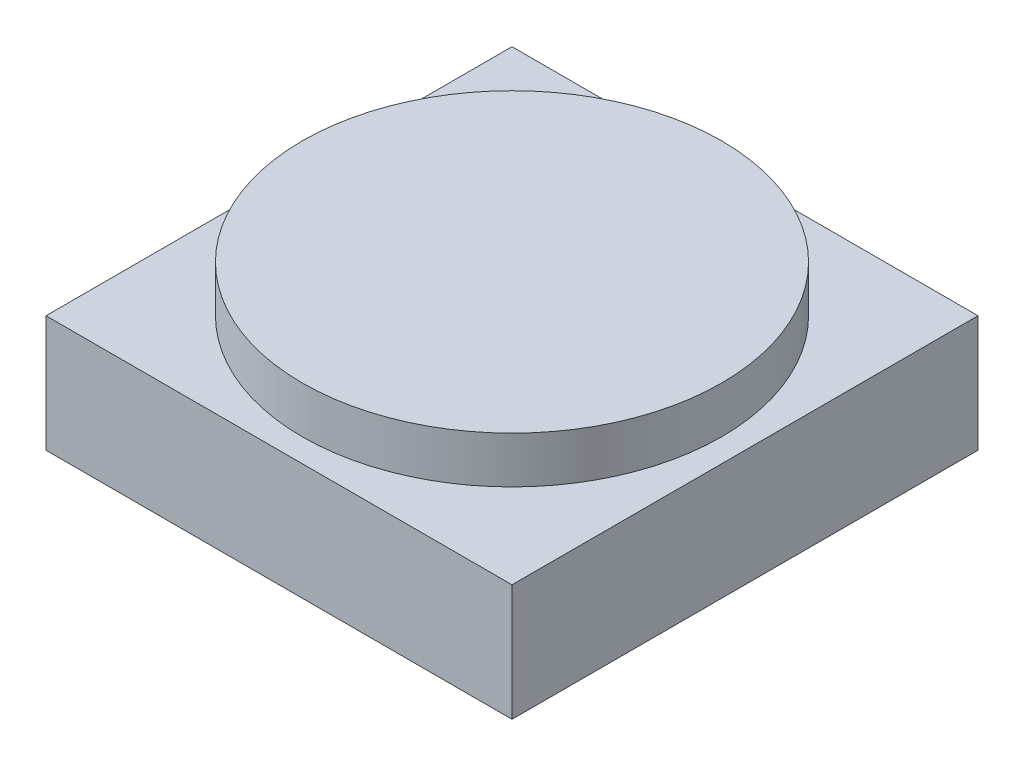
ISO-10303-21;
HEADER;
FILE_DESCRIPTION(('STEP AP214'),'2;1');
FILE_NAME('part.step','',(''),(''),'','','');
FILE_SCHEMA(('AUTOMOTIVE_DESIGN { 1 0 10303 214 1 1 1 1 }'));
ENDSEC;
DATA;
#1=APPLICATION_CONTEXT('core data for automotive mechanical design processes');
#2=APPLICATION_PROTOCOL_DEFINITION('international standard','automotive_design',2000,#1);
#3=PRODUCT_CONTEXT('',#1,'mechanical');
#4=PRODUCT('Part','Part','',(#3));
#5=PRODUCT_RELATED_PRODUCT_CATEGORY('part','',(#4));
#6=PRODUCT_DEFINITION_FORMATION('','',#4);
#7=PRODUCT_DEFINITION_CONTEXT('part definition',#1,'design');
#8=PRODUCT_DEFINITION('design','',#6,#7);
#9=PRODUCT_DEFINITION_SHAPE('','',#8);
#10=(LENGTH_UNIT() NAMED_UNIT(*) SI_UNIT(.MILLI.,.METRE.));
#11=(NAMED_UNIT(*) PLANE_ANGLE_UNIT() SI_UNIT($,.RADIAN.));
#12=(NAMED_UNIT(*) SI_UNIT($,.STERADIAN.) SOLID_ANGLE_UNIT());
#13=UNCERTAINTY_MEASURE_WITH_UNIT(LENGTH_MEASURE(1.E-05),#10,'distance_accuracy_value','');
#14=(GEOMETRIC_REPRESENTATION_CONTEXT(3) GLOBAL_UNCERTAINTY_ASSIGNED_CONTEXT((#13)) GLOBAL_UNIT_ASSIGNED_CONTEXT((#10,
#11,#12)) REPRESENTATION_CONTEXT('',''));
#15=CARTESIAN_POINT('',(0.,0.,0.));
#16=DIRECTION('',(0.,0.,1.));
#17=DIRECTION('',(1.,0.,0.));
#18=AXIS2_PLACEMENT_3D('',#15,#16,#17);
#19=CARTESIAN_POINT('',(0.,11.1125,0.));
#20=DIRECTION('',(0.,-1.,0.));
#21=DIRECTION('',(0.,0.,-1.));
#22=AXIS2_PLACEMENT_3D('',#19,#20,#21);
#23=CYLINDRICAL_SURFACE('',#22,14.2875);
#24=CARTESIAN_POINT('',(0.,11.1125,0.));
#25=DIRECTION('',(0.,1.,0.));
#26=DIRECTION('',(0.,0.,1.));
#27=AXIS2_PLACEMENT_3D('',#24,#25,#26);
#28=CIRCLE('',#27,14.2875);
#29=CARTESIAN_POINT('',(0.,11.1125,14.2875));
#30=VERTEX_POINT('',#29);
#31=EDGE_CURVE('E11',#30,#30,#28,.T.);
#32=ORIENTED_EDGE('',*,*,#31,.F.);
#33=EDGE_LOOP('',(#32));
#34=FACE_BOUND('',#33,.T.);
#35=CARTESIAN_POINT('',(0.,7.9375,0.));
#36=DIRECTION('',(0.,1.,0.));
#37=DIRECTION('',(0.,0.,1.));
#38=AXIS2_PLACEMENT_3D('',#35,#36,#37);
#39=CIRCLE('',#38,14.2875);
#40=CARTESIAN_POINT('',(0.,7.9375,14.2875));
#41=VERTEX_POINT('',#40);
#42=EDGE_CURVE('E45',#41,#41,#39,.T.);
#43=ORIENTED_EDGE('',*,*,#42,.T.);
#44=EDGE_LOOP('',(#43));
#45=FACE_BOUND('',#44,.T.);
#46=ADVANCED_FACE('F42',(#34,#45),#23,.T.);
#47=CARTESIAN_POINT('',(0.,11.1125,0.));
#48=DIRECTION('',(0.,1.,0.));
#49=DIRECTION('',(0.,0.,1.));
#50=AXIS2_PLACEMENT_3D('',#47,#48,#49);
#51=PLANE('',#50);
#52=ORIENTED_EDGE('',*,*,#31,.T.);
#53=EDGE_LOOP('',(#52));
#54=FACE_BOUND('',#53,.T.);
#55=ADVANCED_FACE('F57',(#54),#51,.T.);
#56=CARTESIAN_POINT('',(0.,7.9375,0.));
#57=DIRECTION('',(0.,1.,0.));
#58=DIRECTION('',(0.,0.,1.));
#59=AXIS2_PLACEMENT_3D('',#56,#57,#58);
#60=PLANE('',#59);
#61=ORIENTED_EDGE('',*,*,#42,.F.);
#62=EDGE_LOOP('',(#61));
#63=FACE_BOUND('',#62,.T.);
#64=ADVANCED_FACE('F55',(#63),#60,.F.);
#65=CLOSED_SHELL('',(#46,#55,#64));
#66=MANIFOLD_SOLID_BREP('B2',#65);
#67=CARTESIAN_POINT('',(15.875,7.9375,15.875));
#68=DIRECTION('',(-1.,0.,0.));
#69=DIRECTION('',(0.,0.,1.));
#70=AXIS2_PLACEMENT_3D('',#67,#68,#69);
#71=PLANE('',#70);
#72=DIRECTION('',(0.,0.,-1.));
#73=VECTOR('',#72,1.);
#74=CARTESIAN_POINT('',(15.875,0.,15.875));
#75=LINE('',#74,#73);
#76=CARTESIAN_POINT('',(15.875,0.,15.875));
#77=VERTEX_POINT('',#76);
#78=CARTESIAN_POINT('',(15.875,0.,-15.875));
#79=VERTEX_POINT('',#78);
#80=EDGE_CURVE('E145',#77,#79,#75,.T.);
#81=ORIENTED_EDGE('',*,*,#80,.T.);
#82=DIRECTION('',(0.,-1.,0.));
#83=VECTOR('',#82,1.);
#84=CARTESIAN_POINT('',(15.875,7.9375,-15.875));
#85=LINE('',#84,#83);
#86=CARTESIAN_POINT('',(15.875,7.9375,-15.875));
#87=VERTEX_POINT('',#86);
#88=EDGE_CURVE('E40',#87,#79,#85,.T.);
#89=ORIENTED_EDGE('',*,*,#88,.F.);
#90=DIRECTION('',(0.,0.,-1.));
#91=VECTOR('',#90,1.);
#92=CARTESIAN_POINT('',(15.875,7.9375,15.875));
#93=LINE('',#92,#91);
#94=CARTESIAN_POINT('',(15.875,7.9375,15.875));
#95=VERTEX_POINT('',#94);
#96=EDGE_CURVE('E133',#95,#87,#93,.T.);
#97=ORIENTED_EDGE('',*,*,#96,.F.);
#98=DIRECTION('',(0.,-1.,0.));
#99=VECTOR('',#98,1.);
#100=CARTESIAN_POINT('',(15.875,7.9375,15.875));
#101=LINE('',#100,#99);
#102=EDGE_CURVE('E141',#95,#77,#101,.T.);
#103=ORIENTED_EDGE('',*,*,#102,.T.);
#104=EDGE_LOOP('',(#81,#89,#97,#103));
#105=FACE_BOUND('',#104,.T.);
#106=ADVANCED_FACE('F82',(#105),#71,.F.);
#107=CARTESIAN_POINT('',(-15.875,7.9375,-15.875));
#108=DIRECTION('',(0.,0.,1.));
#109=DIRECTION('',(1.,0.,0.));
#110=AXIS2_PLACEMENT_3D('',#107,#108,#109);
#111=PLANE('',#110);
#112=DIRECTION('',(-1.,0.,0.));
#113=VECTOR('',#112,1.);
#114=CARTESIAN_POINT('',(-15.875,0.,-15.875));
#115=LINE('',#114,#113);
#116=CARTESIAN_POINT('',(-15.875,0.,-15.875));
#117=VERTEX_POINT('',#116);
#118=EDGE_CURVE('E137',#79,#117,#115,.T.);
#119=ORIENTED_EDGE('',*,*,#118,.T.);
#120=DIRECTION('',(0.,-1.,0.));
#121=VECTOR('',#120,1.);
#122=CARTESIAN_POINT('',(-15.875,7.9375,-15.875));
#123=LINE('',#122,#121);
#124=CARTESIAN_POINT('',(-15.875,7.9375,-15.875));
#125=VERTEX_POINT('',#124);
#126=EDGE_CURVE('E90',#125,#117,#123,.T.);
#127=ORIENTED_EDGE('',*,*,#126,.F.);
#128=DIRECTION('',(-1.,0.,0.));
#129=VECTOR('',#128,1.);
#130=CARTESIAN_POINT('',(-15.875,7.9375,-15.875));
#131=LINE('',#130,#129);
#132=EDGE_CURVE('E128',#87,#125,#131,.T.);
#133=ORIENTED_EDGE('',*,*,#132,.F.);
#134=ORIENTED_EDGE('',*,*,#88,.T.);
#135=EDGE_LOOP('',(#119,#127,#133,#134));
#136=FACE_BOUND('',#135,.T.);
#137=ADVANCED_FACE('F136',(#136),#111,.F.);
#138=CARTESIAN_POINT('',(-15.875,7.9375,15.875));
#139=DIRECTION('',(1.,0.,0.));
#140=DIRECTION('',(0.,0.,-1.));
#141=AXIS2_PLACEMENT_3D('',#138,#139,#140);
#142=PLANE('',#141);
#143=DIRECTION('',(0.,0.,1.));
#144=VECTOR('',#143,1.);
#145=CARTESIAN_POINT('',(-15.875,0.,15.875));
#146=LINE('',#145,#144);
#147=CARTESIAN_POINT('',(-15.875,0.,15.875));
#148=VERTEX_POINT('',#147);
#149=EDGE_CURVE('E115',#117,#148,#146,.T.);
#150=ORIENTED_EDGE('',*,*,#149,.T.);
#151=DIRECTION('',(0.,-1.,0.));
#152=VECTOR('',#151,1.);
#153=CARTESIAN_POINT('',(-15.875,7.9375,15.875));
#154=LINE('',#153,#152);
#155=CARTESIAN_POINT('',(-15.875,7.9375,15.875));
#156=VERTEX_POINT('',#155);
#157=EDGE_CURVE('E138',#156,#148,#154,.T.);
#158=ORIENTED_EDGE('',*,*,#157,.F.);
#159=DIRECTION('',(0.,0.,1.));
#160=VECTOR('',#159,1.);
#161=CARTESIAN_POINT('',(-15.875,7.9375,15.875));
#162=LINE('',#161,#160);
#163=EDGE_CURVE('E131',#125,#156,#162,.T.);
#164=ORIENTED_EDGE('',*,*,#163,.F.);
#165=ORIENTED_EDGE('',*,*,#126,.T.);
#166=EDGE_LOOP('',(#150,#158,#164,#165));
#167=FACE_BOUND('',#166,.T.);
#168=ADVANCED_FACE('F139',(#167),#142,.F.);
#169=CARTESIAN_POINT('',(-15.875,7.9375,15.875));
#170=DIRECTION('',(0.,0.,-1.));
#171=DIRECTION('',(-1.,0.,0.));
#172=AXIS2_PLACEMENT_3D('',#169,#170,#171);
#173=PLANE('',#172);
#174=DIRECTION('',(1.,0.,0.));
#175=VECTOR('',#174,1.);
#176=CARTESIAN_POINT('',(-15.875,0.,15.875));
#177=LINE('',#176,#175);
#178=EDGE_CURVE('E121',#148,#77,#177,.T.);
#179=ORIENTED_EDGE('',*,*,#178,.T.);
#180=ORIENTED_EDGE('',*,*,#102,.F.);
#181=DIRECTION('',(1.,0.,0.));
#182=VECTOR('',#181,1.);
#183=CARTESIAN_POINT('',(-15.875,7.9375,15.875));
#184=LINE('',#183,#182);
#185=EDGE_CURVE('E98',#156,#95,#184,.T.);
#186=ORIENTED_EDGE('',*,*,#185,.F.);
#187=ORIENTED_EDGE('',*,*,#157,.T.);
#188=EDGE_LOOP('',(#179,#180,#186,#187));
#189=FACE_BOUND('',#188,.T.);
#190=ADVANCED_FACE('F152',(#189),#173,.F.);
#191=CARTESIAN_POINT('',(0.,7.9375,0.));
#192=DIRECTION('',(0.,-1.,0.));
#193=DIRECTION('',(0.,0.,-1.));
#194=AXIS2_PLACEMENT_3D('',#191,#192,#193);
#195=PLANE('',#194);
#196=ORIENTED_EDGE('',*,*,#96,.T.);
#197=ORIENTED_EDGE('',*,*,#132,.T.);
#198=ORIENTED_EDGE('',*,*,#163,.T.);
#199=ORIENTED_EDGE('',*,*,#185,.T.);
#200=EDGE_LOOP('',(#196,#197,#198,#199));
#201=FACE_BOUND('',#200,.T.);
#202=ADVANCED_FACE('F129',(#201),#195,.F.);
#203=CARTESIAN_POINT('',(0.,0.,0.));
#204=DIRECTION('',(0.,-1.,0.));
#205=DIRECTION('',(0.,0.,-1.));
#206=AXIS2_PLACEMENT_3D('',#203,#204,#205);
#207=PLANE('',#206);
#208=ORIENTED_EDGE('',*,*,#80,.F.);
#209=ORIENTED_EDGE('',*,*,#178,.F.);
#210=ORIENTED_EDGE('',*,*,#149,.F.);
#211=ORIENTED_EDGE('',*,*,#118,.F.);
#212=EDGE_LOOP('',(#208,#209,#210,#211));
#213=FACE_BOUND('',#212,.T.);
#214=ADVANCED_FACE('F155',(#213),#207,.T.);
#215=CLOSED_SHELL('',(#106,#137,#168,#190,#202,#214));
#216=MANIFOLD_SOLID_BREP('B6',#215);
#217=ADVANCED_BREP_SHAPE_REPRESENTATION('',(#18,#66,#216),#14);
#218=SHAPE_DEFINITION_REPRESENTATION(#9,#217);
ENDSEC;
END-ISO-10303-21;
